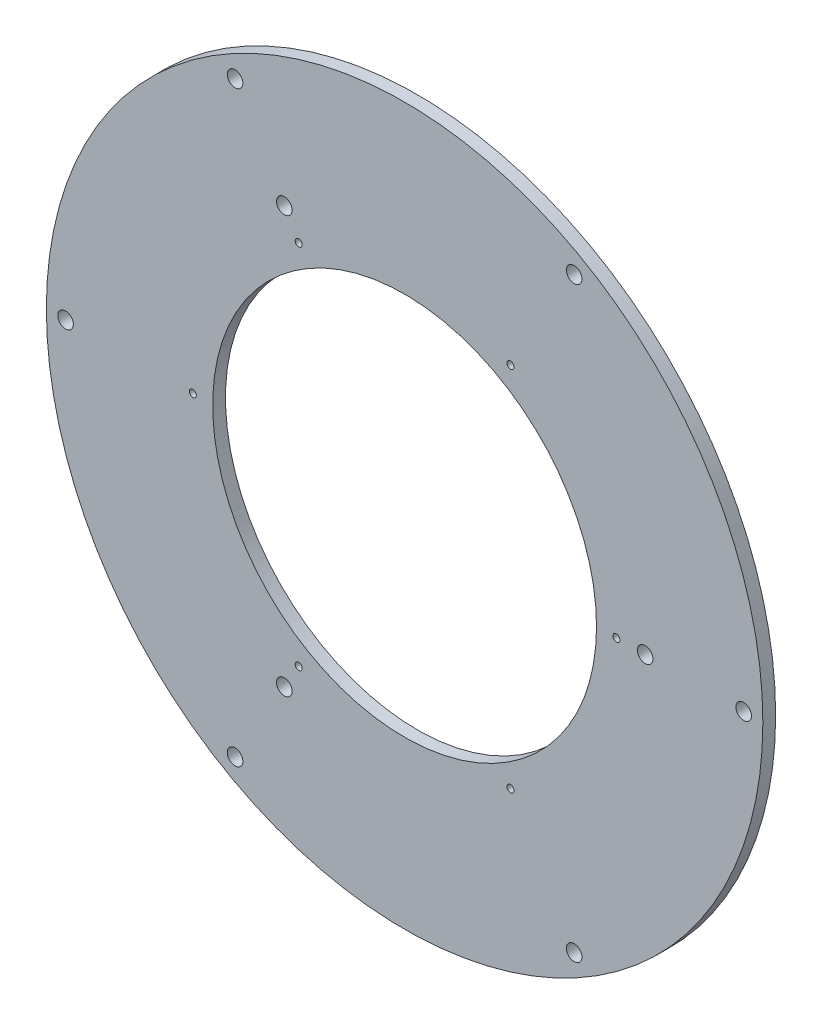
ISO-10303-21;
HEADER;
FILE_DESCRIPTION(('STEP AP214'),'2;1');
FILE_NAME('part.step','',(''),(''),'','','');
FILE_SCHEMA(('AUTOMOTIVE_DESIGN { 1 0 10303 214 1 1 1 1 }'));
ENDSEC;
DATA;
#1=APPLICATION_CONTEXT('core data for automotive mechanical design processes');
#2=APPLICATION_PROTOCOL_DEFINITION('international standard','automotive_design',2000,#1);
#3=PRODUCT_CONTEXT('',#1,'mechanical');
#4=PRODUCT('Part','Part','',(#3));
#5=PRODUCT_RELATED_PRODUCT_CATEGORY('part','',(#4));
#6=PRODUCT_DEFINITION_FORMATION('','',#4);
#7=PRODUCT_DEFINITION_CONTEXT('part definition',#1,'design');
#8=PRODUCT_DEFINITION('design','',#6,#7);
#9=PRODUCT_DEFINITION_SHAPE('','',#8);
#10=(LENGTH_UNIT() NAMED_UNIT(*) SI_UNIT(.MILLI.,.METRE.));
#11=(NAMED_UNIT(*) PLANE_ANGLE_UNIT() SI_UNIT($,.RADIAN.));
#12=(NAMED_UNIT(*) SI_UNIT($,.STERADIAN.) SOLID_ANGLE_UNIT());
#13=UNCERTAINTY_MEASURE_WITH_UNIT(LENGTH_MEASURE(1.E-05),#10,'distance_accuracy_value','');
#14=(GEOMETRIC_REPRESENTATION_CONTEXT(3) GLOBAL_UNCERTAINTY_ASSIGNED_CONTEXT((#13)) GLOBAL_UNIT_ASSIGNED_CONTEXT((#10,
#11,#12)) REPRESENTATION_CONTEXT('',''));
#15=CARTESIAN_POINT('',(0.,0.,0.));
#16=DIRECTION('',(0.,0.,1.));
#17=DIRECTION('',(1.,0.,0.));
#18=AXIS2_PLACEMENT_3D('',#15,#16,#17);
#19=CARTESIAN_POINT('',(0.,0.,10.));
#20=DIRECTION('',(0.,0.,1.));
#21=DIRECTION('',(1.,0.,0.));
#22=AXIS2_PLACEMENT_3D('',#19,#20,#21);
#23=PLANE('',#22);
#24=CARTESIAN_POINT('',(-132.499999999998,229.496732002878,10.));
#25=DIRECTION('',(0.,0.,1.));
#26=DIRECTION('',(1.,0.,0.));
#27=AXIS2_PLACEMENT_3D('',#24,#25,#26);
#28=CIRCLE('',#27,6.09999999999998);
#29=CARTESIAN_POINT('',(-126.399999999998,229.496732002878,10.));
#30=VERTEX_POINT('',#29);
#31=EDGE_CURVE('E127',#30,#30,#28,.T.);
#32=ORIENTED_EDGE('',*,*,#31,.F.);
#33=EDGE_LOOP('',(#32));
#34=FACE_BOUND('',#33,.T.);
#35=CARTESIAN_POINT('',(-132.500000000001,-229.496732002876,10.));
#36=DIRECTION('',(0.,0.,1.));
#37=DIRECTION('',(1.,0.,0.));
#38=AXIS2_PLACEMENT_3D('',#35,#36,#37);
#39=CIRCLE('',#38,6.09999999999997);
#40=CARTESIAN_POINT('',(-126.400000000001,-229.496732002876,10.));
#41=VERTEX_POINT('',#40);
#42=EDGE_CURVE('E115',#41,#41,#39,.T.);
#43=ORIENTED_EDGE('',*,*,#42,.F.);
#44=EDGE_LOOP('',(#43));
#45=FACE_BOUND('',#44,.T.);
#46=CARTESIAN_POINT('',(-93.9999999999985,162.812775911475,10.));
#47=DIRECTION('',(0.,0.,1.));
#48=DIRECTION('',(1.,0.,0.));
#49=AXIS2_PLACEMENT_3D('',#46,#47,#48);
#50=CIRCLE('',#49,6.09999999999999);
#51=CARTESIAN_POINT('',(-87.8999999999985,162.812775911475,10.));
#52=VERTEX_POINT('',#51);
#53=EDGE_CURVE('E103',#52,#52,#50,.T.);
#54=ORIENTED_EDGE('',*,*,#53,.F.);
#55=EDGE_LOOP('',(#54));
#56=FACE_BOUND('',#55,.T.);
#57=CARTESIAN_POINT('',(82.7500000000017,143.327204326324,10.));
#58=DIRECTION('',(0.,0.,1.));
#59=DIRECTION('',(1.,0.,0.));
#60=AXIS2_PLACEMENT_3D('',#57,#58,#59);
#61=CIRCLE('',#60,2.75000000000002);
#62=CARTESIAN_POINT('',(85.5000000000017,143.327204326324,10.));
#63=VERTEX_POINT('',#62);
#64=EDGE_CURVE('E91',#63,#63,#61,.T.);
#65=ORIENTED_EDGE('',*,*,#64,.F.);
#66=EDGE_LOOP('',(#65));
#67=FACE_BOUND('',#66,.T.);
#68=CARTESIAN_POINT('',(-165.5,1.15698136576406E-12,10.));
#69=DIRECTION('',(0.,0.,1.));
#70=DIRECTION('',(1.,0.,0.));
#71=AXIS2_PLACEMENT_3D('',#68,#69,#70);
#72=CIRCLE('',#71,2.75);
#73=CARTESIAN_POINT('',(-162.75,1.15698136576406E-12,10.));
#74=VERTEX_POINT('',#73);
#75=EDGE_CURVE('E79',#74,#74,#72,.T.);
#76=ORIENTED_EDGE('',*,*,#75,.F.);
#77=EDGE_LOOP('',(#76));
#78=FACE_BOUND('',#77,.T.);
#79=CARTESIAN_POINT('',(265.,0.,10.));
#80=DIRECTION('',(0.,0.,1.));
#81=DIRECTION('',(1.,0.,0.));
#82=AXIS2_PLACEMENT_3D('',#79,#80,#81);
#83=CIRCLE('',#82,6.09999999999998);
#84=CARTESIAN_POINT('',(271.1,0.,10.));
#85=VERTEX_POINT('',#84);
#86=EDGE_CURVE('E67',#85,#85,#83,.T.);
#87=ORIENTED_EDGE('',*,*,#86,.F.);
#88=EDGE_LOOP('',(#87));
#89=FACE_BOUND('',#88,.T.);
#90=CARTESIAN_POINT('',(165.5,0.,10.));
#91=DIRECTION('',(0.,0.,1.));
#92=DIRECTION('',(1.,0.,0.));
#93=AXIS2_PLACEMENT_3D('',#90,#91,#92);
#94=CIRCLE('',#93,2.75000000000001);
#95=CARTESIAN_POINT('',(168.25,0.,10.));
#96=VERTEX_POINT('',#95);
#97=EDGE_CURVE('E55',#96,#96,#94,.T.);
#98=ORIENTED_EDGE('',*,*,#97,.F.);
#99=EDGE_LOOP('',(#98));
#100=FACE_BOUND('',#99,.T.);
#101=CARTESIAN_POINT('',(0.,0.,10.));
#102=DIRECTION('',(0.,0.,1.));
#103=DIRECTION('',(1.,0.,0.));
#104=AXIS2_PLACEMENT_3D('',#101,#102,#103);
#105=CIRCLE('',#104,150.);
#106=CARTESIAN_POINT('',(150.,0.,10.));
#107=VERTEX_POINT('',#106);
#108=EDGE_CURVE('E44',#107,#107,#105,.T.);
#109=ORIENTED_EDGE('',*,*,#108,.F.);
#110=EDGE_LOOP('',(#109));
#111=FACE_BOUND('',#110,.T.);
#112=CARTESIAN_POINT('',(0.,0.,10.));
#113=DIRECTION('',(0.,0.,1.));
#114=DIRECTION('',(1.,0.,0.));
#115=AXIS2_PLACEMENT_3D('',#112,#113,#114);
#116=CIRCLE('',#115,280.);
#117=CARTESIAN_POINT('',(280.,0.,10.));
#118=VERTEX_POINT('',#117);
#119=EDGE_CURVE('E10',#118,#118,#116,.T.);
#120=ORIENTED_EDGE('',*,*,#119,.T.);
#121=EDGE_LOOP('',(#120));
#122=FACE_BOUND('',#121,.T.);
#123=CARTESIAN_POINT('',(188.,0.,10.));
#124=DIRECTION('',(0.,0.,1.));
#125=DIRECTION('',(1.,0.,0.));
#126=AXIS2_PLACEMENT_3D('',#123,#124,#125);
#127=CIRCLE('',#126,6.09999999999998);
#128=CARTESIAN_POINT('',(194.1,0.,10.));
#129=VERTEX_POINT('',#128);
#130=EDGE_CURVE('E49',#129,#129,#127,.T.);
#131=ORIENTED_EDGE('',*,*,#130,.F.);
#132=EDGE_LOOP('',(#131));
#133=FACE_BOUND('',#132,.T.);
#134=CARTESIAN_POINT('',(82.7499999999996,-143.327204326325,10.));
#135=DIRECTION('',(0.,0.,1.));
#136=DIRECTION('',(1.,0.,0.));
#137=AXIS2_PLACEMENT_3D('',#134,#135,#136);
#138=CIRCLE('',#137,2.75);
#139=CARTESIAN_POINT('',(85.4999999999996,-143.327204326325,10.));
#140=VERTEX_POINT('',#139);
#141=EDGE_CURVE('E61',#140,#140,#138,.T.);
#142=ORIENTED_EDGE('',*,*,#141,.F.);
#143=EDGE_LOOP('',(#142));
#144=FACE_BOUND('',#143,.T.);
#145=CARTESIAN_POINT('',(-82.7500000000007,-143.327204326324,10.));
#146=DIRECTION('',(0.,0.,1.));
#147=DIRECTION('',(1.,0.,0.));
#148=AXIS2_PLACEMENT_3D('',#145,#146,#147);
#149=CIRCLE('',#148,2.75000000000002);
#150=CARTESIAN_POINT('',(-80.0000000000007,-143.327204326324,10.));
#151=VERTEX_POINT('',#150);
#152=EDGE_CURVE('E73',#151,#151,#149,.T.);
#153=ORIENTED_EDGE('',*,*,#152,.F.);
#154=EDGE_LOOP('',(#153));
#155=FACE_BOUND('',#154,.T.);
#156=CARTESIAN_POINT('',(-82.7499999999987,143.327204326325,10.));
#157=DIRECTION('',(0.,0.,1.));
#158=DIRECTION('',(1.,0.,0.));
#159=AXIS2_PLACEMENT_3D('',#156,#157,#158);
#160=CIRCLE('',#159,2.74999999999999);
#161=CARTESIAN_POINT('',(-79.9999999999987,143.327204326325,10.));
#162=VERTEX_POINT('',#161);
#163=EDGE_CURVE('E85',#162,#162,#160,.T.);
#164=ORIENTED_EDGE('',*,*,#163,.F.);
#165=EDGE_LOOP('',(#164));
#166=FACE_BOUND('',#165,.T.);
#167=CARTESIAN_POINT('',(-94.0000000000008,-162.812775911474,10.));
#168=DIRECTION('',(0.,0.,1.));
#169=DIRECTION('',(1.,0.,0.));
#170=AXIS2_PLACEMENT_3D('',#167,#168,#169);
#171=CIRCLE('',#170,6.09999999999997);
#172=CARTESIAN_POINT('',(-87.9000000000008,-162.812775911474,10.));
#173=VERTEX_POINT('',#172);
#174=EDGE_CURVE('E97',#173,#173,#171,.T.);
#175=ORIENTED_EDGE('',*,*,#174,.F.);
#176=EDGE_LOOP('',(#175));
#177=FACE_BOUND('',#176,.T.);
#178=CARTESIAN_POINT('',(132.5,-229.496732002877,10.));
#179=DIRECTION('',(0.,0.,1.));
#180=DIRECTION('',(1.,0.,0.));
#181=AXIS2_PLACEMENT_3D('',#178,#179,#180);
#182=CIRCLE('',#181,6.09999999999998);
#183=CARTESIAN_POINT('',(138.6,-229.496732002877,10.));
#184=VERTEX_POINT('',#183);
#185=EDGE_CURVE('E109',#184,#184,#182,.T.);
#186=ORIENTED_EDGE('',*,*,#185,.F.);
#187=EDGE_LOOP('',(#186));
#188=FACE_BOUND('',#187,.T.);
#189=CARTESIAN_POINT('',(-265.,1.84441357742094E-12,10.));
#190=DIRECTION('',(0.,0.,1.));
#191=DIRECTION('',(1.,0.,0.));
#192=AXIS2_PLACEMENT_3D('',#189,#190,#191);
#193=CIRCLE('',#192,6.09999999999997);
#194=CARTESIAN_POINT('',(-258.9,1.84441357742094E-12,10.));
#195=VERTEX_POINT('',#194);
#196=EDGE_CURVE('E121',#195,#195,#193,.T.);
#197=ORIENTED_EDGE('',*,*,#196,.F.);
#198=EDGE_LOOP('',(#197));
#199=FACE_BOUND('',#198,.T.);
#200=CARTESIAN_POINT('',(132.500000000003,229.496732002875,10.));
#201=DIRECTION('',(0.,0.,1.));
#202=DIRECTION('',(1.,0.,0.));
#203=AXIS2_PLACEMENT_3D('',#200,#201,#202);
#204=CIRCLE('',#203,6.10000000000001);
#205=CARTESIAN_POINT('',(138.600000000003,229.496732002875,10.));
#206=VERTEX_POINT('',#205);
#207=EDGE_CURVE('E133',#206,#206,#204,.T.);
#208=ORIENTED_EDGE('',*,*,#207,.F.);
#209=EDGE_LOOP('',(#208));
#210=FACE_BOUND('',#209,.T.);
#211=ADVANCED_FACE('F33',(#34,#45,#56,#67,#78,#89,#100,#111,#122,#133,#144,#155,#166,#177,#188,
#199,#210),#23,.T.);
#212=CARTESIAN_POINT('',(0.,0.,0.));
#213=DIRECTION('',(0.,0.,1.));
#214=DIRECTION('',(1.,0.,0.));
#215=AXIS2_PLACEMENT_3D('',#212,#213,#214);
#216=PLANE('',#215);
#217=CARTESIAN_POINT('',(0.,0.,0.));
#218=DIRECTION('',(0.,0.,1.));
#219=DIRECTION('',(1.,0.,0.));
#220=AXIS2_PLACEMENT_3D('',#217,#218,#219);
#221=CIRCLE('',#220,280.);
#222=CARTESIAN_POINT('',(280.,0.,0.));
#223=VERTEX_POINT('',#222);
#224=EDGE_CURVE('E37',#223,#223,#221,.T.);
#225=ORIENTED_EDGE('',*,*,#224,.F.);
#226=EDGE_LOOP('',(#225));
#227=FACE_BOUND('',#226,.T.);
#228=CARTESIAN_POINT('',(0.,0.,0.));
#229=DIRECTION('',(0.,0.,1.));
#230=DIRECTION('',(1.,0.,0.));
#231=AXIS2_PLACEMENT_3D('',#228,#229,#230);
#232=CIRCLE('',#231,150.);
#233=CARTESIAN_POINT('',(150.,0.,0.));
#234=VERTEX_POINT('',#233);
#235=EDGE_CURVE('E46',#234,#234,#232,.T.);
#236=ORIENTED_EDGE('',*,*,#235,.T.);
#237=EDGE_LOOP('',(#236));
#238=FACE_BOUND('',#237,.T.);
#239=CARTESIAN_POINT('',(188.,0.,0.));
#240=DIRECTION('',(0.,0.,1.));
#241=DIRECTION('',(1.,0.,0.));
#242=AXIS2_PLACEMENT_3D('',#239,#240,#241);
#243=CIRCLE('',#242,6.09999999999998);
#244=CARTESIAN_POINT('',(194.1,0.,0.));
#245=VERTEX_POINT('',#244);
#246=EDGE_CURVE('E52',#245,#245,#243,.T.);
#247=ORIENTED_EDGE('',*,*,#246,.T.);
#248=EDGE_LOOP('',(#247));
#249=FACE_BOUND('',#248,.T.);
#250=CARTESIAN_POINT('',(165.5,0.,0.));
#251=DIRECTION('',(0.,0.,1.));
#252=DIRECTION('',(1.,0.,0.));
#253=AXIS2_PLACEMENT_3D('',#250,#251,#252);
#254=CIRCLE('',#253,2.75000000000001);
#255=CARTESIAN_POINT('',(168.25,0.,0.));
#256=VERTEX_POINT('',#255);
#257=EDGE_CURVE('E58',#256,#256,#254,.T.);
#258=ORIENTED_EDGE('',*,*,#257,.T.);
#259=EDGE_LOOP('',(#258));
#260=FACE_BOUND('',#259,.T.);
#261=CARTESIAN_POINT('',(82.7499999999996,-143.327204326325,0.));
#262=DIRECTION('',(0.,0.,1.));
#263=DIRECTION('',(1.,0.,0.));
#264=AXIS2_PLACEMENT_3D('',#261,#262,#263);
#265=CIRCLE('',#264,2.75);
#266=CARTESIAN_POINT('',(85.4999999999996,-143.327204326325,0.));
#267=VERTEX_POINT('',#266);
#268=EDGE_CURVE('E64',#267,#267,#265,.T.);
#269=ORIENTED_EDGE('',*,*,#268,.T.);
#270=EDGE_LOOP('',(#269));
#271=FACE_BOUND('',#270,.T.);
#272=CARTESIAN_POINT('',(265.,0.,0.));
#273=DIRECTION('',(0.,0.,1.));
#274=DIRECTION('',(1.,0.,0.));
#275=AXIS2_PLACEMENT_3D('',#272,#273,#274);
#276=CIRCLE('',#275,6.09999999999998);
#277=CARTESIAN_POINT('',(271.1,0.,0.));
#278=VERTEX_POINT('',#277);
#279=EDGE_CURVE('E70',#278,#278,#276,.T.);
#280=ORIENTED_EDGE('',*,*,#279,.T.);
#281=EDGE_LOOP('',(#280));
#282=FACE_BOUND('',#281,.T.);
#283=CARTESIAN_POINT('',(-82.7500000000007,-143.327204326324,0.));
#284=DIRECTION('',(0.,0.,1.));
#285=DIRECTION('',(1.,0.,0.));
#286=AXIS2_PLACEMENT_3D('',#283,#284,#285);
#287=CIRCLE('',#286,2.75000000000002);
#288=CARTESIAN_POINT('',(-80.0000000000007,-143.327204326324,0.));
#289=VERTEX_POINT('',#288);
#290=EDGE_CURVE('E76',#289,#289,#287,.T.);
#291=ORIENTED_EDGE('',*,*,#290,.T.);
#292=EDGE_LOOP('',(#291));
#293=FACE_BOUND('',#292,.T.);
#294=CARTESIAN_POINT('',(-165.5,1.15698136576406E-12,0.));
#295=DIRECTION('',(0.,0.,1.));
#296=DIRECTION('',(1.,0.,0.));
#297=AXIS2_PLACEMENT_3D('',#294,#295,#296);
#298=CIRCLE('',#297,2.75);
#299=CARTESIAN_POINT('',(-162.75,1.15698136576406E-12,0.));
#300=VERTEX_POINT('',#299);
#301=EDGE_CURVE('E82',#300,#300,#298,.T.);
#302=ORIENTED_EDGE('',*,*,#301,.T.);
#303=EDGE_LOOP('',(#302));
#304=FACE_BOUND('',#303,.T.);
#305=CARTESIAN_POINT('',(-82.7499999999987,143.327204326325,0.));
#306=DIRECTION('',(0.,0.,1.));
#307=DIRECTION('',(1.,0.,0.));
#308=AXIS2_PLACEMENT_3D('',#305,#306,#307);
#309=CIRCLE('',#308,2.74999999999999);
#310=CARTESIAN_POINT('',(-79.9999999999987,143.327204326325,0.));
#311=VERTEX_POINT('',#310);
#312=EDGE_CURVE('E88',#311,#311,#309,.T.);
#313=ORIENTED_EDGE('',*,*,#312,.T.);
#314=EDGE_LOOP('',(#313));
#315=FACE_BOUND('',#314,.T.);
#316=CARTESIAN_POINT('',(82.7500000000017,143.327204326324,0.));
#317=DIRECTION('',(0.,0.,1.));
#318=DIRECTION('',(1.,0.,0.));
#319=AXIS2_PLACEMENT_3D('',#316,#317,#318);
#320=CIRCLE('',#319,2.75000000000002);
#321=CARTESIAN_POINT('',(85.5000000000017,143.327204326324,0.));
#322=VERTEX_POINT('',#321);
#323=EDGE_CURVE('E94',#322,#322,#320,.T.);
#324=ORIENTED_EDGE('',*,*,#323,.T.);
#325=EDGE_LOOP('',(#324));
#326=FACE_BOUND('',#325,.T.);
#327=CARTESIAN_POINT('',(-94.0000000000008,-162.812775911474,0.));
#328=DIRECTION('',(0.,0.,1.));
#329=DIRECTION('',(1.,0.,0.));
#330=AXIS2_PLACEMENT_3D('',#327,#328,#329);
#331=CIRCLE('',#330,6.09999999999997);
#332=CARTESIAN_POINT('',(-87.9000000000008,-162.812775911474,0.));
#333=VERTEX_POINT('',#332);
#334=EDGE_CURVE('E100',#333,#333,#331,.T.);
#335=ORIENTED_EDGE('',*,*,#334,.T.);
#336=EDGE_LOOP('',(#335));
#337=FACE_BOUND('',#336,.T.);
#338=CARTESIAN_POINT('',(-93.9999999999985,162.812775911475,0.));
#339=DIRECTION('',(0.,0.,1.));
#340=DIRECTION('',(1.,0.,0.));
#341=AXIS2_PLACEMENT_3D('',#338,#339,#340);
#342=CIRCLE('',#341,6.09999999999999);
#343=CARTESIAN_POINT('',(-87.8999999999985,162.812775911475,0.));
#344=VERTEX_POINT('',#343);
#345=EDGE_CURVE('E106',#344,#344,#342,.T.);
#346=ORIENTED_EDGE('',*,*,#345,.T.);
#347=EDGE_LOOP('',(#346));
#348=FACE_BOUND('',#347,.T.);
#349=CARTESIAN_POINT('',(132.5,-229.496732002877,0.));
#350=DIRECTION('',(0.,0.,1.));
#351=DIRECTION('',(1.,0.,0.));
#352=AXIS2_PLACEMENT_3D('',#349,#350,#351);
#353=CIRCLE('',#352,6.09999999999998);
#354=CARTESIAN_POINT('',(138.6,-229.496732002877,0.));
#355=VERTEX_POINT('',#354);
#356=EDGE_CURVE('E112',#355,#355,#353,.T.);
#357=ORIENTED_EDGE('',*,*,#356,.T.);
#358=EDGE_LOOP('',(#357));
#359=FACE_BOUND('',#358,.T.);
#360=CARTESIAN_POINT('',(-132.500000000001,-229.496732002876,0.));
#361=DIRECTION('',(0.,0.,1.));
#362=DIRECTION('',(1.,0.,0.));
#363=AXIS2_PLACEMENT_3D('',#360,#361,#362);
#364=CIRCLE('',#363,6.09999999999997);
#365=CARTESIAN_POINT('',(-126.400000000001,-229.496732002876,0.));
#366=VERTEX_POINT('',#365);
#367=EDGE_CURVE('E118',#366,#366,#364,.T.);
#368=ORIENTED_EDGE('',*,*,#367,.T.);
#369=EDGE_LOOP('',(#368));
#370=FACE_BOUND('',#369,.T.);
#371=CARTESIAN_POINT('',(-265.,1.84441357742094E-12,0.));
#372=DIRECTION('',(0.,0.,1.));
#373=DIRECTION('',(1.,0.,0.));
#374=AXIS2_PLACEMENT_3D('',#371,#372,#373);
#375=CIRCLE('',#374,6.09999999999997);
#376=CARTESIAN_POINT('',(-258.9,1.84441357742094E-12,0.));
#377=VERTEX_POINT('',#376);
#378=EDGE_CURVE('E124',#377,#377,#375,.T.);
#379=ORIENTED_EDGE('',*,*,#378,.T.);
#380=EDGE_LOOP('',(#379));
#381=FACE_BOUND('',#380,.T.);
#382=CARTESIAN_POINT('',(-132.499999999998,229.496732002878,0.));
#383=DIRECTION('',(0.,0.,1.));
#384=DIRECTION('',(1.,0.,0.));
#385=AXIS2_PLACEMENT_3D('',#382,#383,#384);
#386=CIRCLE('',#385,6.09999999999998);
#387=CARTESIAN_POINT('',(-126.399999999998,229.496732002878,0.));
#388=VERTEX_POINT('',#387);
#389=EDGE_CURVE('E130',#388,#388,#386,.T.);
#390=ORIENTED_EDGE('',*,*,#389,.T.);
#391=EDGE_LOOP('',(#390));
#392=FACE_BOUND('',#391,.T.);
#393=CARTESIAN_POINT('',(132.500000000003,229.496732002875,0.));
#394=DIRECTION('',(0.,0.,1.));
#395=DIRECTION('',(1.,0.,0.));
#396=AXIS2_PLACEMENT_3D('',#393,#394,#395);
#397=CIRCLE('',#396,6.10000000000001);
#398=CARTESIAN_POINT('',(138.600000000003,229.496732002875,0.));
#399=VERTEX_POINT('',#398);
#400=EDGE_CURVE('E136',#399,#399,#397,.T.);
#401=ORIENTED_EDGE('',*,*,#400,.T.);
#402=EDGE_LOOP('',(#401));
#403=FACE_BOUND('',#402,.T.);
#404=ADVANCED_FACE('F146',(#227,#238,#249,#260,#271,#282,#293,#304,#315,#326,#337,#348,#359,
#370,#381,#392,#403),#216,.F.);
#405=CARTESIAN_POINT('',(0.,0.,10.));
#406=DIRECTION('',(0.,0.,-1.));
#407=DIRECTION('',(-1.,0.,0.));
#408=AXIS2_PLACEMENT_3D('',#405,#406,#407);
#409=CYLINDRICAL_SURFACE('',#408,280.);
#410=ORIENTED_EDGE('',*,*,#119,.F.);
#411=EDGE_LOOP('',(#410));
#412=FACE_BOUND('',#411,.T.);
#413=ORIENTED_EDGE('',*,*,#224,.T.);
#414=EDGE_LOOP('',(#413));
#415=FACE_BOUND('',#414,.T.);
#416=ADVANCED_FACE('F35',(#412,#415),#409,.T.);
#417=CARTESIAN_POINT('',(0.,0.,10.));
#418=DIRECTION('',(0.,0.,-1.));
#419=DIRECTION('',(-1.,0.,0.));
#420=AXIS2_PLACEMENT_3D('',#417,#418,#419);
#421=CYLINDRICAL_SURFACE('',#420,150.);
#422=ORIENTED_EDGE('',*,*,#108,.T.);
#423=EDGE_LOOP('',(#422));
#424=FACE_BOUND('',#423,.T.);
#425=ORIENTED_EDGE('',*,*,#235,.F.);
#426=EDGE_LOOP('',(#425));
#427=FACE_BOUND('',#426,.T.);
#428=ADVANCED_FACE('F156',(#424,#427),#421,.F.);
#429=CARTESIAN_POINT('',(188.,0.,10.));
#430=DIRECTION('',(0.,0.,-1.));
#431=DIRECTION('',(-1.,0.,0.));
#432=AXIS2_PLACEMENT_3D('',#429,#430,#431);
#433=CYLINDRICAL_SURFACE('',#432,6.09999999999998);
#434=ORIENTED_EDGE('',*,*,#130,.T.);
#435=EDGE_LOOP('',(#434));
#436=FACE_BOUND('',#435,.T.);
#437=ORIENTED_EDGE('',*,*,#246,.F.);
#438=EDGE_LOOP('',(#437));
#439=FACE_BOUND('',#438,.T.);
#440=ADVANCED_FACE('F159',(#436,#439),#433,.F.);
#441=CARTESIAN_POINT('',(165.5,0.,10.));
#442=DIRECTION('',(0.,0.,-1.));
#443=DIRECTION('',(-1.,0.,0.));
#444=AXIS2_PLACEMENT_3D('',#441,#442,#443);
#445=CYLINDRICAL_SURFACE('',#444,2.75000000000001);
#446=ORIENTED_EDGE('',*,*,#97,.T.);
#447=EDGE_LOOP('',(#446));
#448=FACE_BOUND('',#447,.T.);
#449=ORIENTED_EDGE('',*,*,#257,.F.);
#450=EDGE_LOOP('',(#449));
#451=FACE_BOUND('',#450,.T.);
#452=ADVANCED_FACE('F163',(#448,#451),#445,.F.);
#453=CARTESIAN_POINT('',(82.7499999999996,-143.327204326325,10.));
#454=DIRECTION('',(0.,0.,-1.));
#455=DIRECTION('',(-1.,0.,0.));
#456=AXIS2_PLACEMENT_3D('',#453,#454,#455);
#457=CYLINDRICAL_SURFACE('',#456,2.75);
#458=ORIENTED_EDGE('',*,*,#141,.T.);
#459=EDGE_LOOP('',(#458));
#460=FACE_BOUND('',#459,.T.);
#461=ORIENTED_EDGE('',*,*,#268,.F.);
#462=EDGE_LOOP('',(#461));
#463=FACE_BOUND('',#462,.T.);
#464=ADVANCED_FACE('F167',(#460,#463),#457,.F.);
#465=CARTESIAN_POINT('',(265.,0.,10.));
#466=DIRECTION('',(0.,0.,-1.));
#467=DIRECTION('',(-1.,0.,0.));
#468=AXIS2_PLACEMENT_3D('',#465,#466,#467);
#469=CYLINDRICAL_SURFACE('',#468,6.09999999999998);
#470=ORIENTED_EDGE('',*,*,#86,.T.);
#471=EDGE_LOOP('',(#470));
#472=FACE_BOUND('',#471,.T.);
#473=ORIENTED_EDGE('',*,*,#279,.F.);
#474=EDGE_LOOP('',(#473));
#475=FACE_BOUND('',#474,.T.);
#476=ADVANCED_FACE('F171',(#472,#475),#469,.F.);
#477=CARTESIAN_POINT('',(-82.7500000000007,-143.327204326324,10.));
#478=DIRECTION('',(0.,0.,-1.));
#479=DIRECTION('',(-1.,0.,0.));
#480=AXIS2_PLACEMENT_3D('',#477,#478,#479);
#481=CYLINDRICAL_SURFACE('',#480,2.75000000000002);
#482=ORIENTED_EDGE('',*,*,#152,.T.);
#483=EDGE_LOOP('',(#482));
#484=FACE_BOUND('',#483,.T.);
#485=ORIENTED_EDGE('',*,*,#290,.F.);
#486=EDGE_LOOP('',(#485));
#487=FACE_BOUND('',#486,.T.);
#488=ADVANCED_FACE('F175',(#484,#487),#481,.F.);
#489=CARTESIAN_POINT('',(-165.5,1.15698136576406E-12,10.));
#490=DIRECTION('',(0.,0.,-1.));
#491=DIRECTION('',(-1.,0.,0.));
#492=AXIS2_PLACEMENT_3D('',#489,#490,#491);
#493=CYLINDRICAL_SURFACE('',#492,2.75);
#494=ORIENTED_EDGE('',*,*,#75,.T.);
#495=EDGE_LOOP('',(#494));
#496=FACE_BOUND('',#495,.T.);
#497=ORIENTED_EDGE('',*,*,#301,.F.);
#498=EDGE_LOOP('',(#497));
#499=FACE_BOUND('',#498,.T.);
#500=ADVANCED_FACE('F179',(#496,#499),#493,.F.);
#501=CARTESIAN_POINT('',(-82.7499999999987,143.327204326325,10.));
#502=DIRECTION('',(0.,0.,-1.));
#503=DIRECTION('',(-1.,0.,0.));
#504=AXIS2_PLACEMENT_3D('',#501,#502,#503);
#505=CYLINDRICAL_SURFACE('',#504,2.74999999999999);
#506=ORIENTED_EDGE('',*,*,#163,.T.);
#507=EDGE_LOOP('',(#506));
#508=FACE_BOUND('',#507,.T.);
#509=ORIENTED_EDGE('',*,*,#312,.F.);
#510=EDGE_LOOP('',(#509));
#511=FACE_BOUND('',#510,.T.);
#512=ADVANCED_FACE('F183',(#508,#511),#505,.F.);
#513=CARTESIAN_POINT('',(82.7500000000017,143.327204326324,10.));
#514=DIRECTION('',(0.,0.,-1.));
#515=DIRECTION('',(-1.,0.,0.));
#516=AXIS2_PLACEMENT_3D('',#513,#514,#515);
#517=CYLINDRICAL_SURFACE('',#516,2.75000000000002);
#518=ORIENTED_EDGE('',*,*,#64,.T.);
#519=EDGE_LOOP('',(#518));
#520=FACE_BOUND('',#519,.T.);
#521=ORIENTED_EDGE('',*,*,#323,.F.);
#522=EDGE_LOOP('',(#521));
#523=FACE_BOUND('',#522,.T.);
#524=ADVANCED_FACE('F187',(#520,#523),#517,.F.);
#525=CARTESIAN_POINT('',(-94.0000000000008,-162.812775911474,10.));
#526=DIRECTION('',(0.,0.,-1.));
#527=DIRECTION('',(-1.,0.,0.));
#528=AXIS2_PLACEMENT_3D('',#525,#526,#527);
#529=CYLINDRICAL_SURFACE('',#528,6.09999999999997);
#530=ORIENTED_EDGE('',*,*,#174,.T.);
#531=EDGE_LOOP('',(#530));
#532=FACE_BOUND('',#531,.T.);
#533=ORIENTED_EDGE('',*,*,#334,.F.);
#534=EDGE_LOOP('',(#533));
#535=FACE_BOUND('',#534,.T.);
#536=ADVANCED_FACE('F191',(#532,#535),#529,.F.);
#537=CARTESIAN_POINT('',(-93.9999999999985,162.812775911475,10.));
#538=DIRECTION('',(0.,0.,-1.));
#539=DIRECTION('',(-1.,0.,0.));
#540=AXIS2_PLACEMENT_3D('',#537,#538,#539);
#541=CYLINDRICAL_SURFACE('',#540,6.09999999999999);
#542=ORIENTED_EDGE('',*,*,#53,.T.);
#543=EDGE_LOOP('',(#542));
#544=FACE_BOUND('',#543,.T.);
#545=ORIENTED_EDGE('',*,*,#345,.F.);
#546=EDGE_LOOP('',(#545));
#547=FACE_BOUND('',#546,.T.);
#548=ADVANCED_FACE('F195',(#544,#547),#541,.F.);
#549=CARTESIAN_POINT('',(132.5,-229.496732002877,10.));
#550=DIRECTION('',(0.,0.,-1.));
#551=DIRECTION('',(-1.,0.,0.));
#552=AXIS2_PLACEMENT_3D('',#549,#550,#551);
#553=CYLINDRICAL_SURFACE('',#552,6.09999999999998);
#554=ORIENTED_EDGE('',*,*,#185,.T.);
#555=EDGE_LOOP('',(#554));
#556=FACE_BOUND('',#555,.T.);
#557=ORIENTED_EDGE('',*,*,#356,.F.);
#558=EDGE_LOOP('',(#557));
#559=FACE_BOUND('',#558,.T.);
#560=ADVANCED_FACE('F199',(#556,#559),#553,.F.);
#561=CARTESIAN_POINT('',(-132.500000000001,-229.496732002876,10.));
#562=DIRECTION('',(0.,0.,-1.));
#563=DIRECTION('',(-1.,0.,0.));
#564=AXIS2_PLACEMENT_3D('',#561,#562,#563);
#565=CYLINDRICAL_SURFACE('',#564,6.09999999999997);
#566=ORIENTED_EDGE('',*,*,#42,.T.);
#567=EDGE_LOOP('',(#566));
#568=FACE_BOUND('',#567,.T.);
#569=ORIENTED_EDGE('',*,*,#367,.F.);
#570=EDGE_LOOP('',(#569));
#571=FACE_BOUND('',#570,.T.);
#572=ADVANCED_FACE('F203',(#568,#571),#565,.F.);
#573=CARTESIAN_POINT('',(-265.,1.84441357742094E-12,10.));
#574=DIRECTION('',(0.,0.,-1.));
#575=DIRECTION('',(-1.,0.,0.));
#576=AXIS2_PLACEMENT_3D('',#573,#574,#575);
#577=CYLINDRICAL_SURFACE('',#576,6.09999999999997);
#578=ORIENTED_EDGE('',*,*,#196,.T.);
#579=EDGE_LOOP('',(#578));
#580=FACE_BOUND('',#579,.T.);
#581=ORIENTED_EDGE('',*,*,#378,.F.);
#582=EDGE_LOOP('',(#581));
#583=FACE_BOUND('',#582,.T.);
#584=ADVANCED_FACE('F207',(#580,#583),#577,.F.);
#585=CARTESIAN_POINT('',(-132.499999999998,229.496732002878,10.));
#586=DIRECTION('',(0.,0.,-1.));
#587=DIRECTION('',(-1.,0.,0.));
#588=AXIS2_PLACEMENT_3D('',#585,#586,#587);
#589=CYLINDRICAL_SURFACE('',#588,6.09999999999998);
#590=ORIENTED_EDGE('',*,*,#31,.T.);
#591=EDGE_LOOP('',(#590));
#592=FACE_BOUND('',#591,.T.);
#593=ORIENTED_EDGE('',*,*,#389,.F.);
#594=EDGE_LOOP('',(#593));
#595=FACE_BOUND('',#594,.T.);
#596=ADVANCED_FACE('F211',(#592,#595),#589,.F.);
#597=CARTESIAN_POINT('',(132.500000000003,229.496732002875,10.));
#598=DIRECTION('',(0.,0.,-1.));
#599=DIRECTION('',(-1.,0.,0.));
#600=AXIS2_PLACEMENT_3D('',#597,#598,#599);
#601=CYLINDRICAL_SURFACE('',#600,6.10000000000001);
#602=ORIENTED_EDGE('',*,*,#207,.T.);
#603=EDGE_LOOP('',(#602));
#604=FACE_BOUND('',#603,.T.);
#605=ORIENTED_EDGE('',*,*,#400,.F.);
#606=EDGE_LOOP('',(#605));
#607=FACE_BOUND('',#606,.T.);
#608=ADVANCED_FACE('F142',(#604,#607),#601,.F.);
#609=CLOSED_SHELL('',(#211,#404,#416,#428,#440,#452,#464,#476,#488,#500,#512,#524,#536,#548,
#560,#572,#584,#596,#608));
#610=MANIFOLD_SOLID_BREP('B2',#609);
#611=ADVANCED_BREP_SHAPE_REPRESENTATION('',(#18,#610),#14);
#612=SHAPE_DEFINITION_REPRESENTATION(#9,#611);
ENDSEC;
END-ISO-10303-21;
